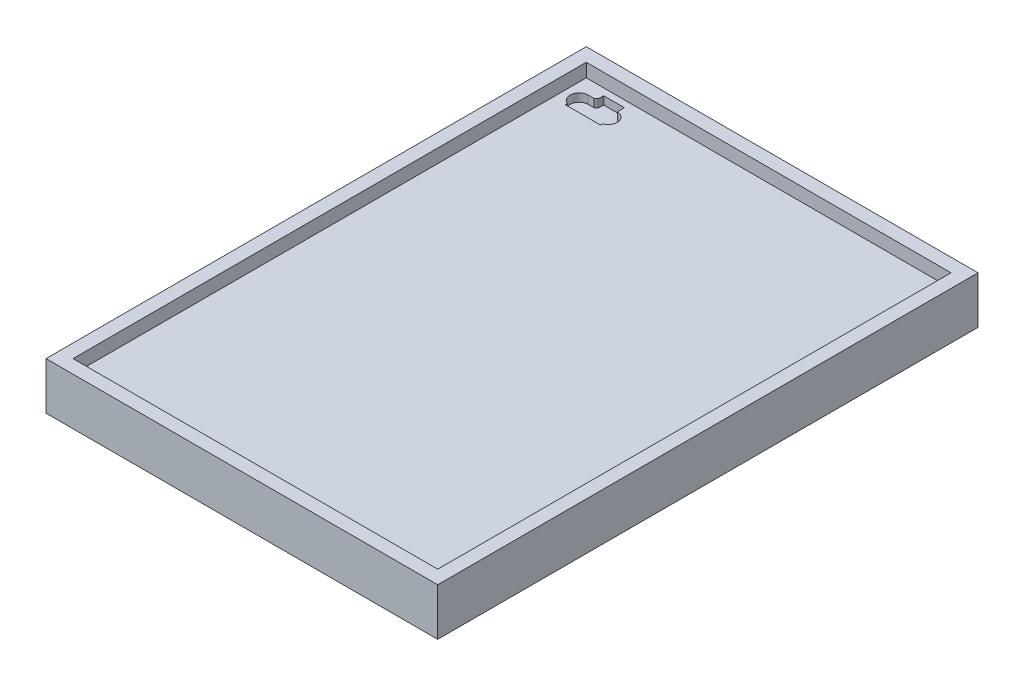
ISO-10303-21;
HEADER;
FILE_DESCRIPTION(('STEP AP214'),'2;1');
FILE_NAME('part.step','',(''),(''),'','','');
FILE_SCHEMA(('AUTOMOTIVE_DESIGN { 1 0 10303 214 1 1 1 1 }'));
ENDSEC;
DATA;
#1=APPLICATION_CONTEXT('core data for automotive mechanical design processes');
#2=APPLICATION_PROTOCOL_DEFINITION('international standard','automotive_design',2000,#1);
#3=PRODUCT_CONTEXT('',#1,'mechanical');
#4=PRODUCT('Part','Part','',(#3));
#5=PRODUCT_RELATED_PRODUCT_CATEGORY('part','',(#4));
#6=PRODUCT_DEFINITION_FORMATION('','',#4);
#7=PRODUCT_DEFINITION_CONTEXT('part definition',#1,'design');
#8=PRODUCT_DEFINITION('design','',#6,#7);
#9=PRODUCT_DEFINITION_SHAPE('','',#8);
#10=(LENGTH_UNIT() NAMED_UNIT(*) SI_UNIT(.MILLI.,.METRE.));
#11=(NAMED_UNIT(*) PLANE_ANGLE_UNIT() SI_UNIT($,.RADIAN.));
#12=(NAMED_UNIT(*) SI_UNIT($,.STERADIAN.) SOLID_ANGLE_UNIT());
#13=UNCERTAINTY_MEASURE_WITH_UNIT(LENGTH_MEASURE(1.E-05),#10,'distance_accuracy_value','');
#14=(GEOMETRIC_REPRESENTATION_CONTEXT(3) GLOBAL_UNCERTAINTY_ASSIGNED_CONTEXT((#13)) GLOBAL_UNIT_ASSIGNED_CONTEXT((#10,
#11,#12)) REPRESENTATION_CONTEXT('',''));
#15=CARTESIAN_POINT('',(0.,0.,0.));
#16=DIRECTION('',(0.,0.,1.));
#17=DIRECTION('',(1.,0.,0.));
#18=AXIS2_PLACEMENT_3D('',#15,#16,#17);
#19=CARTESIAN_POINT('',(0.,25.,0.));
#20=DIRECTION('',(0.,1.,0.));
#21=DIRECTION('',(0.,0.,1.));
#22=AXIS2_PLACEMENT_3D('',#19,#20,#21);
#23=PLANE('',#22);
#24=DIRECTION('',(1.,0.,0.));
#25=VECTOR('',#24,1.);
#26=CARTESIAN_POINT('',(-135.,25.,190.));
#27=LINE('',#26,#25);
#28=CARTESIAN_POINT('',(-135.,25.,190.));
#29=VERTEX_POINT('',#28);
#30=CARTESIAN_POINT('',(135.,25.,190.));
#31=VERTEX_POINT('',#30);
#32=EDGE_CURVE('E241',#29,#31,#27,.T.);
#33=ORIENTED_EDGE('',*,*,#32,.T.);
#34=DIRECTION('',(0.,0.,-1.));
#35=VECTOR('',#34,1.);
#36=CARTESIAN_POINT('',(135.,25.,190.));
#37=LINE('',#36,#35);
#38=CARTESIAN_POINT('',(135.,25.,-190.));
#39=VERTEX_POINT('',#38);
#40=EDGE_CURVE('E244',#31,#39,#37,.T.);
#41=ORIENTED_EDGE('',*,*,#40,.T.);
#42=DIRECTION('',(-1.,0.,0.));
#43=VECTOR('',#42,1.);
#44=CARTESIAN_POINT('',(135.,25.,-190.));
#45=LINE('',#44,#43);
#46=CARTESIAN_POINT('',(-135.,25.,-190.));
#47=VERTEX_POINT('',#46);
#48=EDGE_CURVE('E248',#39,#47,#45,.T.);
#49=ORIENTED_EDGE('',*,*,#48,.T.);
#50=DIRECTION('',(0.,0.,1.));
#51=VECTOR('',#50,1.);
#52=CARTESIAN_POINT('',(-135.,25.,-190.));
#53=LINE('',#52,#51);
#54=EDGE_CURVE('E251',#47,#29,#53,.T.);
#55=ORIENTED_EDGE('',*,*,#54,.T.);
#56=EDGE_LOOP('',(#33,#41,#49,#55));
#57=FACE_BOUND('',#56,.T.);
#58=DIRECTION('',(0.,0.,-1.));
#59=VECTOR('',#58,1.);
#60=CARTESIAN_POINT('',(-101.75,25.,2.66427341404739E-13));
#61=LINE('',#60,#59);
#62=CARTESIAN_POINT('',(-101.75,25.,-180.182738070745));
#63=VERTEX_POINT('',#62);
#64=CARTESIAN_POINT('',(-101.75,25.,-184.5));
#65=VERTEX_POINT('',#64);
#66=EDGE_CURVE('E398',#63,#65,#61,.T.);
#67=ORIENTED_EDGE('',*,*,#66,.F.);
#68=CARTESIAN_POINT('',(-101.25,25.,-180.182738070745));
#69=DIRECTION('',(0.,1.,0.));
#70=DIRECTION('',(0.,0.,1.));
#71=AXIS2_PLACEMENT_3D('',#68,#69,#70);
#72=CIRCLE('',#71,0.5);
#73=CARTESIAN_POINT('',(-101.284482758621,25.,-179.683928548624));
#74=VERTEX_POINT('',#73);
#75=EDGE_CURVE('E333',#63,#74,#72,.T.);
#76=ORIENTED_EDGE('',*,*,#75,.T.);
#77=CARTESIAN_POINT('',(-101.75,25.,-172.95));
#78=DIRECTION('',(0.,1.,0.));
#79=DIRECTION('',(0.,0.,1.));
#80=AXIS2_PLACEMENT_3D('',#77,#78,#79);
#81=CIRCLE('',#80,6.74999999999998);
#82=CARTESIAN_POINT('',(-99.1022841051659,25.,-166.740966215244));
#83=VERTEX_POINT('',#82);
#84=EDGE_CURVE('E396',#74,#83,#81,.F.);
#85=ORIENTED_EDGE('',*,*,#84,.T.);
#86=CARTESIAN_POINT('',(-98.9061570018448,25.,-166.281037786743));
#87=DIRECTION('',(0.,1.,0.));
#88=DIRECTION('',(0.,0.,1.));
#89=AXIS2_PLACEMENT_3D('',#86,#87,#88);
#90=CIRCLE('',#89,0.5);
#91=CARTESIAN_POINT('',(-99.4061570018448,25.,-166.281037786743));
#92=VERTEX_POINT('',#91);
#93=EDGE_CURVE('E323',#83,#92,#90,.T.);
#94=ORIENTED_EDGE('',*,*,#93,.T.);
#95=DIRECTION('',(0.,0.,1.));
#96=VECTOR('',#95,1.);
#97=CARTESIAN_POINT('',(-99.4061570018448,25.,0.));
#98=LINE('',#97,#96);
#99=CARTESIAN_POINT('',(-99.4061570018448,25.,-165.5));
#100=VERTEX_POINT('',#99);
#101=EDGE_CURVE('E410',#92,#100,#98,.T.);
#102=ORIENTED_EDGE('',*,*,#101,.T.);
#103=CARTESIAN_POINT('',(-99.9061570018448,25.,-165.5));
#104=DIRECTION('',(0.,1.,0.));
#105=DIRECTION('',(0.,0.,1.));
#106=AXIS2_PLACEMENT_3D('',#103,#104,#105);
#107=CIRCLE('',#106,0.5);
#108=CARTESIAN_POINT('',(-99.9061570018448,25.,-165.));
#109=VERTEX_POINT('',#108);
#110=EDGE_CURVE('E11',#100,#109,#107,.F.);
#111=ORIENTED_EDGE('',*,*,#110,.T.);
#112=DIRECTION('',(1.,0.,0.));
#113=VECTOR('',#112,1.);
#114=CARTESIAN_POINT('',(0.,25.,-165.));
#115=LINE('',#114,#113);
#116=CARTESIAN_POINT('',(-125.093842998155,25.,-165.));
#117=VERTEX_POINT('',#116);
#118=EDGE_CURVE('E376',#117,#109,#115,.T.);
#119=ORIENTED_EDGE('',*,*,#118,.F.);
#120=CARTESIAN_POINT('',(-125.093842998155,25.,-165.5));
#121=DIRECTION('',(0.,1.,0.));
#122=DIRECTION('',(0.,0.,1.));
#123=AXIS2_PLACEMENT_3D('',#120,#121,#122);
#124=CIRCLE('',#123,0.5);
#125=CARTESIAN_POINT('',(-125.593842998155,25.,-165.5));
#126=VERTEX_POINT('',#125);
#127=EDGE_CURVE('E41',#117,#126,#124,.F.);
#128=ORIENTED_EDGE('',*,*,#127,.T.);
#129=DIRECTION('',(0.,0.,1.));
#130=VECTOR('',#129,1.);
#131=CARTESIAN_POINT('',(-125.593842998155,25.,0.));
#132=LINE('',#131,#130);
#133=CARTESIAN_POINT('',(-125.593842998155,25.,-166.281037786743));
#134=VERTEX_POINT('',#133);
#135=EDGE_CURVE('E374',#134,#126,#132,.T.);
#136=ORIENTED_EDGE('',*,*,#135,.F.);
#137=CARTESIAN_POINT('',(-126.093842998155,25.,-166.281037786743));
#138=DIRECTION('',(0.,1.,0.));
#139=DIRECTION('',(0.,0.,1.));
#140=AXIS2_PLACEMENT_3D('',#137,#138,#139);
#141=CIRCLE('',#140,0.5);
#142=CARTESIAN_POINT('',(-125.897715894834,25.,-166.740966215244));
#143=VERTEX_POINT('',#142);
#144=EDGE_CURVE('E314',#134,#143,#141,.T.);
#145=ORIENTED_EDGE('',*,*,#144,.T.);
#146=CARTESIAN_POINT('',(-123.25,25.,-172.95));
#147=DIRECTION('',(0.,1.,0.));
#148=DIRECTION('',(0.,0.,1.));
#149=AXIS2_PLACEMENT_3D('',#146,#147,#148);
#150=CIRCLE('',#149,6.74999999999999);
#151=CARTESIAN_POINT('',(-123.25,25.,-179.7));
#152=VERTEX_POINT('',#151);
#153=EDGE_CURVE('E384',#152,#143,#150,.T.);
#154=ORIENTED_EDGE('',*,*,#153,.F.);
#155=DIRECTION('',(1.,0.,0.));
#156=VECTOR('',#155,1.);
#157=CARTESIAN_POINT('',(-2.28233147419287E-12,25.,-179.700000000001));
#158=LINE('',#157,#156);
#159=CARTESIAN_POINT('',(-118.879314151318,25.,-179.7));
#160=VERTEX_POINT('',#159);
#161=EDGE_CURVE('E406',#152,#160,#158,.T.);
#162=ORIENTED_EDGE('',*,*,#161,.T.);
#163=DIRECTION('',(-0.696937908891496,0.,0.717131474103562));
#164=VECTOR('',#163,1.);
#165=CARTESIAN_POINT('',(-150.950323524299,25.,-146.699742826135));
#166=LINE('',#165,#164);
#167=CARTESIAN_POINT('',(-117.695737051793,25.,-180.917870888165));
#168=VERTEX_POINT('',#167);
#169=EDGE_CURVE('E232',#168,#160,#166,.T.);
#170=ORIENTED_EDGE('',*,*,#169,.F.);
#171=CARTESIAN_POINT('',(-119.13,25.,-182.311746705948));
#172=DIRECTION('',(0.,1.,0.));
#173=DIRECTION('',(0.,0.,1.));
#174=AXIS2_PLACEMENT_3D('',#171,#172,#173);
#175=CIRCLE('',#174,2.);
#176=CARTESIAN_POINT('',(-117.13,25.,-182.311746705948));
#177=VERTEX_POINT('',#176);
#178=EDGE_CURVE('E304',#168,#177,#175,.T.);
#179=ORIENTED_EDGE('',*,*,#178,.T.);
#180=DIRECTION('',(0.,0.,1.));
#181=VECTOR('',#180,1.);
#182=CARTESIAN_POINT('',(-117.13,25.,0.));
#183=LINE('',#182,#181);
#184=CARTESIAN_POINT('',(-117.13,25.,-184.5));
#185=VERTEX_POINT('',#184);
#186=EDGE_CURVE('E403',#185,#177,#183,.T.);
#187=ORIENTED_EDGE('',*,*,#186,.F.);
#188=CARTESIAN_POINT('',(-116.63,25.,-184.5));
#189=DIRECTION('',(0.,1.,0.));
#190=DIRECTION('',(0.,0.,1.));
#191=AXIS2_PLACEMENT_3D('',#188,#189,#190);
#192=CIRCLE('',#191,0.5);
#193=CARTESIAN_POINT('',(-116.63,25.,-185.));
#194=VERTEX_POINT('',#193);
#195=EDGE_CURVE('E356',#185,#194,#192,.F.);
#196=ORIENTED_EDGE('',*,*,#195,.T.);
#197=DIRECTION('',(1.,0.,0.));
#198=VECTOR('',#197,1.);
#199=CARTESIAN_POINT('',(0.,25.,-185.));
#200=LINE('',#199,#198);
#201=CARTESIAN_POINT('',(-102.25,25.,-185.));
#202=VERTEX_POINT('',#201);
#203=EDGE_CURVE('E401',#194,#202,#200,.T.);
#204=ORIENTED_EDGE('',*,*,#203,.T.);
#205=CARTESIAN_POINT('',(-102.25,25.,-184.5));
#206=DIRECTION('',(0.,1.,0.));
#207=DIRECTION('',(0.,0.,1.));
#208=AXIS2_PLACEMENT_3D('',#205,#206,#207);
#209=CIRCLE('',#208,0.5);
#210=EDGE_CURVE('E347',#202,#65,#209,.F.);
#211=ORIENTED_EDGE('',*,*,#210,.T.);
#212=EDGE_LOOP('',(#67,#76,#85,#94,#102,#111,#119,#128,#136,#145,#154,#162,#170,#179,#187,#196,
#204,#211));
#213=FACE_BOUND('',#212,.T.);
#214=ADVANCED_FACE('F33',(#57,#213),#23,.T.);
#215=CARTESIAN_POINT('',(145.,35.,-200.));
#216=DIRECTION('',(-1.,0.,0.));
#217=DIRECTION('',(0.,0.,1.));
#218=AXIS2_PLACEMENT_3D('',#215,#216,#217);
#219=PLANE('',#218);
#220=DIRECTION('',(0.,0.,-1.));
#221=VECTOR('',#220,1.);
#222=CARTESIAN_POINT('',(145.,0.,-200.));
#223=LINE('',#222,#221);
#224=CARTESIAN_POINT('',(145.,0.,200.));
#225=VERTEX_POINT('',#224);
#226=CARTESIAN_POINT('',(145.,0.,-200.));
#227=VERTEX_POINT('',#226);
#228=EDGE_CURVE('E266',#225,#227,#223,.T.);
#229=ORIENTED_EDGE('',*,*,#228,.T.);
#230=DIRECTION('',(0.,-1.,0.));
#231=VECTOR('',#230,1.);
#232=CARTESIAN_POINT('',(145.,35.,-200.));
#233=LINE('',#232,#231);
#234=CARTESIAN_POINT('',(145.,35.,-200.));
#235=VERTEX_POINT('',#234);
#236=EDGE_CURVE('E299',#235,#227,#233,.T.);
#237=ORIENTED_EDGE('',*,*,#236,.F.);
#238=DIRECTION('',(0.,0.,-1.));
#239=VECTOR('',#238,1.);
#240=CARTESIAN_POINT('',(145.,35.,-200.));
#241=LINE('',#240,#239);
#242=CARTESIAN_POINT('',(145.,35.,200.));
#243=VERTEX_POINT('',#242);
#244=EDGE_CURVE('E273',#243,#235,#241,.T.);
#245=ORIENTED_EDGE('',*,*,#244,.F.);
#246=DIRECTION('',(0.,-1.,0.));
#247=VECTOR('',#246,1.);
#248=CARTESIAN_POINT('',(145.,35.,200.));
#249=LINE('',#248,#247);
#250=EDGE_CURVE('E283',#243,#225,#249,.T.);
#251=ORIENTED_EDGE('',*,*,#250,.T.);
#252=EDGE_LOOP('',(#229,#237,#245,#251));
#253=FACE_BOUND('',#252,.T.);
#254=ADVANCED_FACE('F475',(#253),#219,.F.);
#255=CARTESIAN_POINT('',(-145.,35.,-200.));
#256=DIRECTION('',(0.,0.,1.));
#257=DIRECTION('',(1.,0.,0.));
#258=AXIS2_PLACEMENT_3D('',#255,#256,#257);
#259=PLANE('',#258);
#260=DIRECTION('',(-1.,0.,0.));
#261=VECTOR('',#260,1.);
#262=CARTESIAN_POINT('',(-145.,0.,-200.));
#263=LINE('',#262,#261);
#264=CARTESIAN_POINT('',(-145.,0.,-200.));
#265=VERTEX_POINT('',#264);
#266=EDGE_CURVE('E286',#227,#265,#263,.T.);
#267=ORIENTED_EDGE('',*,*,#266,.T.);
#268=DIRECTION('',(0.,-1.,0.));
#269=VECTOR('',#268,1.);
#270=CARTESIAN_POINT('',(-145.,35.,-200.));
#271=LINE('',#270,#269);
#272=CARTESIAN_POINT('',(-145.,35.,-200.));
#273=VERTEX_POINT('',#272);
#274=EDGE_CURVE('E296',#273,#265,#271,.T.);
#275=ORIENTED_EDGE('',*,*,#274,.F.);
#276=DIRECTION('',(-1.,0.,0.));
#277=VECTOR('',#276,1.);
#278=CARTESIAN_POINT('',(-145.,35.,-200.));
#279=LINE('',#278,#277);
#280=EDGE_CURVE('E276',#235,#273,#279,.T.);
#281=ORIENTED_EDGE('',*,*,#280,.F.);
#282=ORIENTED_EDGE('',*,*,#236,.T.);
#283=EDGE_LOOP('',(#267,#275,#281,#282));
#284=FACE_BOUND('',#283,.T.);
#285=ADVANCED_FACE('F483',(#284),#259,.F.);
#286=CARTESIAN_POINT('',(-145.,35.,-200.));
#287=DIRECTION('',(1.,0.,0.));
#288=DIRECTION('',(0.,0.,-1.));
#289=AXIS2_PLACEMENT_3D('',#286,#287,#288);
#290=PLANE('',#289);
#291=DIRECTION('',(0.,0.,1.));
#292=VECTOR('',#291,1.);
#293=CARTESIAN_POINT('',(-145.,0.,-200.));
#294=LINE('',#293,#292);
#295=CARTESIAN_POINT('',(-145.,0.,200.));
#296=VERTEX_POINT('',#295);
#297=EDGE_CURVE('E288',#265,#296,#294,.T.);
#298=ORIENTED_EDGE('',*,*,#297,.T.);
#299=DIRECTION('',(0.,-1.,0.));
#300=VECTOR('',#299,1.);
#301=CARTESIAN_POINT('',(-145.,35.,200.));
#302=LINE('',#301,#300);
#303=CARTESIAN_POINT('',(-145.,35.,200.));
#304=VERTEX_POINT('',#303);
#305=EDGE_CURVE('E293',#304,#296,#302,.T.);
#306=ORIENTED_EDGE('',*,*,#305,.F.);
#307=DIRECTION('',(0.,0.,1.));
#308=VECTOR('',#307,1.);
#309=CARTESIAN_POINT('',(-145.,35.,-200.));
#310=LINE('',#309,#308);
#311=EDGE_CURVE('E279',#273,#304,#310,.T.);
#312=ORIENTED_EDGE('',*,*,#311,.F.);
#313=ORIENTED_EDGE('',*,*,#274,.T.);
#314=EDGE_LOOP('',(#298,#306,#312,#313));
#315=FACE_BOUND('',#314,.T.);
#316=ADVANCED_FACE('F516',(#315),#290,.F.);
#317=CARTESIAN_POINT('',(-145.,35.,200.));
#318=DIRECTION('',(0.,0.,-1.));
#319=DIRECTION('',(-1.,0.,0.));
#320=AXIS2_PLACEMENT_3D('',#317,#318,#319);
#321=PLANE('',#320);
#322=DIRECTION('',(1.,0.,0.));
#323=VECTOR('',#322,1.);
#324=CARTESIAN_POINT('',(-145.,0.,200.));
#325=LINE('',#324,#323);
#326=EDGE_CURVE('E277',#296,#225,#325,.T.);
#327=ORIENTED_EDGE('',*,*,#326,.T.);
#328=ORIENTED_EDGE('',*,*,#250,.F.);
#329=DIRECTION('',(1.,0.,0.));
#330=VECTOR('',#329,1.);
#331=CARTESIAN_POINT('',(-145.,35.,200.));
#332=LINE('',#331,#330);
#333=EDGE_CURVE('E281',#304,#243,#332,.T.);
#334=ORIENTED_EDGE('',*,*,#333,.F.);
#335=ORIENTED_EDGE('',*,*,#305,.T.);
#336=EDGE_LOOP('',(#327,#328,#334,#335));
#337=FACE_BOUND('',#336,.T.);
#338=ADVANCED_FACE('F509',(#337),#321,.F.);
#339=CARTESIAN_POINT('',(0.,35.,0.));
#340=DIRECTION('',(0.,1.,0.));
#341=DIRECTION('',(0.,0.,1.));
#342=AXIS2_PLACEMENT_3D('',#339,#340,#341);
#343=PLANE('',#342);
#344=DIRECTION('',(1.,0.,0.));
#345=VECTOR('',#344,1.);
#346=CARTESIAN_POINT('',(-135.,35.,190.));
#347=LINE('',#346,#345);
#348=CARTESIAN_POINT('',(-135.,35.,190.));
#349=VERTEX_POINT('',#348);
#350=CARTESIAN_POINT('',(135.,35.,190.));
#351=VERTEX_POINT('',#350);
#352=EDGE_CURVE('E235',#349,#351,#347,.T.);
#353=ORIENTED_EDGE('',*,*,#352,.F.);
#354=DIRECTION('',(0.,0.,1.));
#355=VECTOR('',#354,1.);
#356=CARTESIAN_POINT('',(-135.,35.,-190.));
#357=LINE('',#356,#355);
#358=CARTESIAN_POINT('',(-135.,35.,-190.));
#359=VERTEX_POINT('',#358);
#360=EDGE_CURVE('E245',#359,#349,#357,.T.);
#361=ORIENTED_EDGE('',*,*,#360,.F.);
#362=DIRECTION('',(-1.,0.,0.));
#363=VECTOR('',#362,1.);
#364=CARTESIAN_POINT('',(135.,35.,-190.));
#365=LINE('',#364,#363);
#366=CARTESIAN_POINT('',(135.,35.,-190.));
#367=VERTEX_POINT('',#366);
#368=EDGE_CURVE('E259',#367,#359,#365,.T.);
#369=ORIENTED_EDGE('',*,*,#368,.F.);
#370=DIRECTION('',(0.,0.,-1.));
#371=VECTOR('',#370,1.);
#372=CARTESIAN_POINT('',(135.,35.,190.));
#373=LINE('',#372,#371);
#374=EDGE_CURVE('E256',#351,#367,#373,.T.);
#375=ORIENTED_EDGE('',*,*,#374,.F.);
#376=EDGE_LOOP('',(#353,#361,#369,#375));
#377=FACE_BOUND('',#376,.T.);
#378=ORIENTED_EDGE('',*,*,#244,.T.);
#379=ORIENTED_EDGE('',*,*,#280,.T.);
#380=ORIENTED_EDGE('',*,*,#311,.T.);
#381=ORIENTED_EDGE('',*,*,#333,.T.);
#382=EDGE_LOOP('',(#378,#379,#380,#381));
#383=FACE_BOUND('',#382,.T.);
#384=ADVANCED_FACE('F506',(#377,#383),#343,.T.);
#385=CARTESIAN_POINT('',(0.,0.,0.));
#386=DIRECTION('',(0.,1.,0.));
#387=DIRECTION('',(0.,0.,1.));
#388=AXIS2_PLACEMENT_3D('',#385,#386,#387);
#389=PLANE('',#388);
#390=ORIENTED_EDGE('',*,*,#228,.F.);
#391=ORIENTED_EDGE('',*,*,#326,.F.);
#392=ORIENTED_EDGE('',*,*,#297,.F.);
#393=ORIENTED_EDGE('',*,*,#266,.F.);
#394=EDGE_LOOP('',(#390,#391,#392,#393));
#395=FACE_BOUND('',#394,.T.);
#396=ADVANCED_FACE('F504',(#395),#389,.F.);
#397=CARTESIAN_POINT('',(-135.,25.,190.));
#398=DIRECTION('',(0.,0.,1.));
#399=DIRECTION('',(1.,0.,0.));
#400=AXIS2_PLACEMENT_3D('',#397,#398,#399);
#401=PLANE('',#400);
#402=ORIENTED_EDGE('',*,*,#352,.T.);
#403=DIRECTION('',(0.,1.,0.));
#404=VECTOR('',#403,1.);
#405=CARTESIAN_POINT('',(135.,25.,190.));
#406=LINE('',#405,#404);
#407=EDGE_CURVE('E254',#31,#351,#406,.T.);
#408=ORIENTED_EDGE('',*,*,#407,.F.);
#409=ORIENTED_EDGE('',*,*,#32,.F.);
#410=DIRECTION('',(0.,1.,0.));
#411=VECTOR('',#410,1.);
#412=CARTESIAN_POINT('',(-135.,25.,190.));
#413=LINE('',#412,#411);
#414=EDGE_CURVE('E264',#29,#349,#413,.T.);
#415=ORIENTED_EDGE('',*,*,#414,.T.);
#416=EDGE_LOOP('',(#402,#408,#409,#415));
#417=FACE_BOUND('',#416,.T.);
#418=ADVANCED_FACE('F493',(#417),#401,.F.);
#419=CARTESIAN_POINT('',(-135.,25.,-190.));
#420=DIRECTION('',(-1.,0.,0.));
#421=DIRECTION('',(0.,0.,1.));
#422=AXIS2_PLACEMENT_3D('',#419,#420,#421);
#423=PLANE('',#422);
#424=ORIENTED_EDGE('',*,*,#360,.T.);
#425=ORIENTED_EDGE('',*,*,#414,.F.);
#426=ORIENTED_EDGE('',*,*,#54,.F.);
#427=DIRECTION('',(0.,1.,0.));
#428=VECTOR('',#427,1.);
#429=CARTESIAN_POINT('',(-135.,25.,-190.));
#430=LINE('',#429,#428);
#431=EDGE_CURVE('E267',#47,#359,#430,.T.);
#432=ORIENTED_EDGE('',*,*,#431,.T.);
#433=EDGE_LOOP('',(#424,#425,#426,#432));
#434=FACE_BOUND('',#433,.T.);
#435=ADVANCED_FACE('F489',(#434),#423,.F.);
#436=CARTESIAN_POINT('',(135.,25.,-190.));
#437=DIRECTION('',(0.,0.,-1.));
#438=DIRECTION('',(-1.,0.,0.));
#439=AXIS2_PLACEMENT_3D('',#436,#437,#438);
#440=PLANE('',#439);
#441=ORIENTED_EDGE('',*,*,#368,.T.);
#442=ORIENTED_EDGE('',*,*,#431,.F.);
#443=ORIENTED_EDGE('',*,*,#48,.F.);
#444=DIRECTION('',(0.,1.,0.));
#445=VECTOR('',#444,1.);
#446=CARTESIAN_POINT('',(135.,25.,-190.));
#447=LINE('',#446,#445);
#448=EDGE_CURVE('E269',#39,#367,#447,.T.);
#449=ORIENTED_EDGE('',*,*,#448,.T.);
#450=EDGE_LOOP('',(#441,#442,#443,#449));
#451=FACE_BOUND('',#450,.T.);
#452=ADVANCED_FACE('F492',(#451),#440,.F.);
#453=CARTESIAN_POINT('',(135.,25.,190.));
#454=DIRECTION('',(1.,0.,0.));
#455=DIRECTION('',(0.,0.,-1.));
#456=AXIS2_PLACEMENT_3D('',#453,#454,#455);
#457=PLANE('',#456);
#458=ORIENTED_EDGE('',*,*,#374,.T.);
#459=ORIENTED_EDGE('',*,*,#448,.F.);
#460=ORIENTED_EDGE('',*,*,#40,.F.);
#461=ORIENTED_EDGE('',*,*,#407,.T.);
#462=EDGE_LOOP('',(#458,#459,#460,#461));
#463=FACE_BOUND('',#462,.T.);
#464=ADVANCED_FACE('F497',(#463),#457,.F.);
#465=CARTESIAN_POINT('',(-101.75,19.,-172.95));
#466=DIRECTION('',(0.,1.,0.));
#467=DIRECTION('',(0.,0.,1.));
#468=AXIS2_PLACEMENT_3D('',#465,#466,#467);
#469=CYLINDRICAL_SURFACE('',#468,6.74999999999998);
#470=ORIENTED_EDGE('',*,*,#84,.F.);
#471=DIRECTION('',(0.,1.,0.));
#472=VECTOR('',#471,1.);
#473=CARTESIAN_POINT('',(-101.284482758621,19.,-179.683928548624));
#474=LINE('',#473,#472);
#475=CARTESIAN_POINT('',(-101.284482758621,19.,-179.683928548624));
#476=VERTEX_POINT('',#475);
#477=EDGE_CURVE('E335',#74,#476,#474,.F.);
#478=ORIENTED_EDGE('',*,*,#477,.T.);
#479=CARTESIAN_POINT('',(-101.75,19.,-172.95));
#480=DIRECTION('',(0.,1.,0.));
#481=DIRECTION('',(0.,0.,1.));
#482=AXIS2_PLACEMENT_3D('',#479,#480,#481);
#483=CIRCLE('',#482,6.74999999999998);
#484=CARTESIAN_POINT('',(-99.1022841051659,19.,-166.740966215244));
#485=VERTEX_POINT('',#484);
#486=EDGE_CURVE('E412',#476,#485,#483,.F.);
#487=ORIENTED_EDGE('',*,*,#486,.T.);
#488=DIRECTION('',(0.,1.,0.));
#489=VECTOR('',#488,1.);
#490=CARTESIAN_POINT('',(-99.1022841051659,19.,-166.740966215244));
#491=LINE('',#490,#489);
#492=EDGE_CURVE('E320',#485,#83,#491,.T.);
#493=ORIENTED_EDGE('',*,*,#492,.T.);
#494=EDGE_LOOP('',(#470,#478,#487,#493));
#495=FACE_BOUND('',#494,.T.);
#496=ADVANCED_FACE('F462',(#495),#469,.F.);
#497=CARTESIAN_POINT('',(-99.4061570018448,19.,0.));
#498=DIRECTION('',(-1.,0.,0.));
#499=DIRECTION('',(0.,0.,1.));
#500=AXIS2_PLACEMENT_3D('',#497,#498,#499);
#501=PLANE('',#500);
#502=DIRECTION('',(0.,0.,1.));
#503=VECTOR('',#502,1.);
#504=CARTESIAN_POINT('',(-99.4061570018448,19.,0.));
#505=LINE('',#504,#503);
#506=CARTESIAN_POINT('',(-99.4061570018448,19.,-166.281037786743));
#507=VERTEX_POINT('',#506);
#508=CARTESIAN_POINT('',(-99.4061570018448,19.,-165.5));
#509=VERTEX_POINT('',#508);
#510=EDGE_CURVE('E233',#507,#509,#505,.T.);
#511=ORIENTED_EDGE('',*,*,#510,.T.);
#512=DIRECTION('',(0.,1.,0.));
#513=VECTOR('',#512,1.);
#514=CARTESIAN_POINT('',(-99.4061570018448,19.,-165.5));
#515=LINE('',#514,#513);
#516=EDGE_CURVE('E368',#509,#100,#515,.T.);
#517=ORIENTED_EDGE('',*,*,#516,.T.);
#518=ORIENTED_EDGE('',*,*,#101,.F.);
#519=DIRECTION('',(0.,1.,0.));
#520=VECTOR('',#519,1.);
#521=CARTESIAN_POINT('',(-99.4061570018448,19.,-166.281037786743));
#522=LINE('',#521,#520);
#523=EDGE_CURVE('E325',#92,#507,#522,.F.);
#524=ORIENTED_EDGE('',*,*,#523,.T.);
#525=EDGE_LOOP('',(#511,#517,#518,#524));
#526=FACE_BOUND('',#525,.T.);
#527=ADVANCED_FACE('F469',(#526),#501,.T.);
#528=CARTESIAN_POINT('',(0.,19.,-165.));
#529=DIRECTION('',(0.,0.,1.));
#530=DIRECTION('',(1.,0.,0.));
#531=AXIS2_PLACEMENT_3D('',#528,#529,#530);
#532=PLANE('',#531);
#533=DIRECTION('',(1.,0.,0.));
#534=VECTOR('',#533,1.);
#535=CARTESIAN_POINT('',(0.,19.,-165.));
#536=LINE('',#535,#534);
#537=CARTESIAN_POINT('',(-125.093842998155,19.,-165.));
#538=VERTEX_POINT('',#537);
#539=CARTESIAN_POINT('',(-99.9061570018448,19.,-165.));
#540=VERTEX_POINT('',#539);
#541=EDGE_CURVE('E237',#538,#540,#536,.T.);
#542=ORIENTED_EDGE('',*,*,#541,.F.);
#543=DIRECTION('',(0.,1.,0.));
#544=VECTOR('',#543,1.);
#545=CARTESIAN_POINT('',(-125.093842998155,25.,-165.));
#546=LINE('',#545,#544);
#547=EDGE_CURVE('E360',#538,#117,#546,.T.);
#548=ORIENTED_EDGE('',*,*,#547,.T.);
#549=ORIENTED_EDGE('',*,*,#118,.T.);
#550=DIRECTION('',(0.,1.,0.));
#551=VECTOR('',#550,1.);
#552=CARTESIAN_POINT('',(-99.9061570018448,19.,-165.));
#553=LINE('',#552,#551);
#554=EDGE_CURVE('E358',#109,#540,#553,.F.);
#555=ORIENTED_EDGE('',*,*,#554,.T.);
#556=EDGE_LOOP('',(#542,#548,#549,#555));
#557=FACE_BOUND('',#556,.T.);
#558=ADVANCED_FACE('F391',(#557),#532,.F.);
#559=CARTESIAN_POINT('',(-125.593842998155,19.,0.));
#560=DIRECTION('',(-1.,0.,0.));
#561=DIRECTION('',(0.,0.,1.));
#562=AXIS2_PLACEMENT_3D('',#559,#560,#561);
#563=PLANE('',#562);
#564=ORIENTED_EDGE('',*,*,#135,.T.);
#565=DIRECTION('',(0.,1.,0.));
#566=VECTOR('',#565,1.);
#567=CARTESIAN_POINT('',(-125.593842998155,19.,-165.5));
#568=LINE('',#567,#566);
#569=CARTESIAN_POINT('',(-125.593842998155,19.,-165.5));
#570=VERTEX_POINT('',#569);
#571=EDGE_CURVE('E363',#126,#570,#568,.F.);
#572=ORIENTED_EDGE('',*,*,#571,.T.);
#573=DIRECTION('',(0.,0.,1.));
#574=VECTOR('',#573,1.);
#575=CARTESIAN_POINT('',(-125.593842998155,19.,0.));
#576=LINE('',#575,#574);
#577=CARTESIAN_POINT('',(-125.593842998155,19.,-166.281037786743));
#578=VERTEX_POINT('',#577);
#579=EDGE_CURVE('E389',#578,#570,#576,.T.);
#580=ORIENTED_EDGE('',*,*,#579,.F.);
#581=DIRECTION('',(0.,1.,0.));
#582=VECTOR('',#581,1.);
#583=CARTESIAN_POINT('',(-125.593842998155,19.,-166.281037786743));
#584=LINE('',#583,#582);
#585=EDGE_CURVE('E311',#578,#134,#584,.T.);
#586=ORIENTED_EDGE('',*,*,#585,.T.);
#587=EDGE_LOOP('',(#564,#572,#580,#586));
#588=FACE_BOUND('',#587,.T.);
#589=ADVANCED_FACE('F381',(#588),#563,.F.);
#590=CARTESIAN_POINT('',(-123.25,19.,-172.95));
#591=DIRECTION('',(0.,1.,0.));
#592=DIRECTION('',(0.,0.,1.));
#593=AXIS2_PLACEMENT_3D('',#590,#591,#592);
#594=CYLINDRICAL_SURFACE('',#593,6.74999999999999);
#595=ORIENTED_EDGE('',*,*,#153,.T.);
#596=DIRECTION('',(0.,1.,0.));
#597=VECTOR('',#596,1.);
#598=CARTESIAN_POINT('',(-125.897715894834,19.,-166.740966215244));
#599=LINE('',#598,#597);
#600=CARTESIAN_POINT('',(-125.897715894834,19.,-166.740966215244));
#601=VERTEX_POINT('',#600);
#602=EDGE_CURVE('E316',#143,#601,#599,.F.);
#603=ORIENTED_EDGE('',*,*,#602,.T.);
#604=CARTESIAN_POINT('',(-123.25,19.,-172.95));
#605=DIRECTION('',(0.,1.,0.));
#606=DIRECTION('',(0.,0.,1.));
#607=AXIS2_PLACEMENT_3D('',#604,#605,#606);
#608=CIRCLE('',#607,6.74999999999999);
#609=CARTESIAN_POINT('',(-123.25,19.,-179.7));
#610=VERTEX_POINT('',#609);
#611=EDGE_CURVE('E228',#610,#601,#608,.T.);
#612=ORIENTED_EDGE('',*,*,#611,.F.);
#613=DIRECTION('',(0.,1.,0.));
#614=VECTOR('',#613,1.);
#615=CARTESIAN_POINT('',(-123.25,19.,-179.7));
#616=LINE('',#615,#614);
#617=EDGE_CURVE('E227',#610,#152,#616,.T.);
#618=ORIENTED_EDGE('',*,*,#617,.T.);
#619=EDGE_LOOP('',(#595,#603,#612,#618));
#620=FACE_BOUND('',#619,.T.);
#621=ADVANCED_FACE('F429',(#620),#594,.F.);
#622=CARTESIAN_POINT('',(-2.28233147419287E-12,19.,-179.700000000001));
#623=DIRECTION('',(0.,0.,1.));
#624=DIRECTION('',(1.,0.,0.));
#625=AXIS2_PLACEMENT_3D('',#622,#623,#624);
#626=PLANE('',#625);
#627=ORIENTED_EDGE('',*,*,#161,.F.);
#628=ORIENTED_EDGE('',*,*,#617,.F.);
#629=DIRECTION('',(1.,0.,0.));
#630=VECTOR('',#629,1.);
#631=CARTESIAN_POINT('',(-2.28233147419287E-12,19.,-179.700000000001));
#632=LINE('',#631,#630);
#633=CARTESIAN_POINT('',(-118.879314151318,19.,-179.7));
#634=VERTEX_POINT('',#633);
#635=EDGE_CURVE('E211',#610,#634,#632,.T.);
#636=ORIENTED_EDGE('',*,*,#635,.T.);
#637=DIRECTION('',(0.,1.,0.));
#638=VECTOR('',#637,1.);
#639=CARTESIAN_POINT('',(-118.879314151318,19.,-179.7));
#640=LINE('',#639,#638);
#641=EDGE_CURVE('E225',#634,#160,#640,.T.);
#642=ORIENTED_EDGE('',*,*,#641,.T.);
#643=EDGE_LOOP('',(#627,#628,#636,#642));
#644=FACE_BOUND('',#643,.T.);
#645=ADVANCED_FACE('F224',(#644),#626,.T.);
#646=CARTESIAN_POINT('',(-150.950323524299,19.,-146.699742826135));
#647=DIRECTION('',(-0.717131474103562,0.,-0.696937908891496));
#648=DIRECTION('',(-0.696937908891496,0.,0.717131474103562));
#649=AXIS2_PLACEMENT_3D('',#646,#647,#648);
#650=PLANE('',#649);
#651=DIRECTION('',(-0.696937908891496,0.,0.717131474103562));
#652=VECTOR('',#651,1.);
#653=CARTESIAN_POINT('',(-150.950323524299,19.,-146.699742826135));
#654=LINE('',#653,#652);
#655=CARTESIAN_POINT('',(-117.695737051793,19.,-180.917870888165));
#656=VERTEX_POINT('',#655);
#657=EDGE_CURVE('E206',#656,#634,#654,.T.);
#658=ORIENTED_EDGE('',*,*,#657,.F.);
#659=DIRECTION('',(0.,1.,0.));
#660=VECTOR('',#659,1.);
#661=CARTESIAN_POINT('',(-117.695737051793,19.,-180.917870888165));
#662=LINE('',#661,#660);
#663=EDGE_CURVE('E302',#656,#168,#662,.T.);
#664=ORIENTED_EDGE('',*,*,#663,.T.);
#665=ORIENTED_EDGE('',*,*,#169,.T.);
#666=ORIENTED_EDGE('',*,*,#641,.F.);
#667=EDGE_LOOP('',(#658,#664,#665,#666));
#668=FACE_BOUND('',#667,.T.);
#669=ADVANCED_FACE('F230',(#668),#650,.F.);
#670=CARTESIAN_POINT('',(-117.13,19.,0.));
#671=DIRECTION('',(-1.,0.,0.));
#672=DIRECTION('',(0.,0.,1.));
#673=AXIS2_PLACEMENT_3D('',#670,#671,#672);
#674=PLANE('',#673);
#675=DIRECTION('',(0.,0.,1.));
#676=VECTOR('',#675,1.);
#677=CARTESIAN_POINT('',(-117.13,19.,0.));
#678=LINE('',#677,#676);
#679=CARTESIAN_POINT('',(-117.13,19.,-184.5));
#680=VERTEX_POINT('',#679);
#681=CARTESIAN_POINT('',(-117.13,19.,-182.311746705948));
#682=VERTEX_POINT('',#681);
#683=EDGE_CURVE('E219',#680,#682,#678,.T.);
#684=ORIENTED_EDGE('',*,*,#683,.F.);
#685=DIRECTION('',(0.,1.,0.));
#686=VECTOR('',#685,1.);
#687=CARTESIAN_POINT('',(-117.13,19.,-184.5));
#688=LINE('',#687,#686);
#689=EDGE_CURVE('E349',#680,#185,#688,.T.);
#690=ORIENTED_EDGE('',*,*,#689,.T.);
#691=ORIENTED_EDGE('',*,*,#186,.T.);
#692=DIRECTION('',(0.,1.,0.));
#693=VECTOR('',#692,1.);
#694=CARTESIAN_POINT('',(-117.13,19.,-182.311746705948));
#695=LINE('',#694,#693);
#696=EDGE_CURVE('E307',#177,#682,#695,.F.);
#697=ORIENTED_EDGE('',*,*,#696,.T.);
#698=EDGE_LOOP('',(#684,#690,#691,#697));
#699=FACE_BOUND('',#698,.T.);
#700=ADVANCED_FACE('F436',(#699),#674,.F.);
#701=CARTESIAN_POINT('',(0.,19.,-185.));
#702=DIRECTION('',(0.,0.,1.));
#703=DIRECTION('',(1.,0.,0.));
#704=AXIS2_PLACEMENT_3D('',#701,#702,#703);
#705=PLANE('',#704);
#706=ORIENTED_EDGE('',*,*,#203,.F.);
#707=DIRECTION('',(0.,1.,0.));
#708=VECTOR('',#707,1.);
#709=CARTESIAN_POINT('',(-116.63,19.,-185.));
#710=LINE('',#709,#708);
#711=CARTESIAN_POINT('',(-116.63,19.,-185.));
#712=VERTEX_POINT('',#711);
#713=EDGE_CURVE('E352',#194,#712,#710,.F.);
#714=ORIENTED_EDGE('',*,*,#713,.T.);
#715=DIRECTION('',(1.,0.,0.));
#716=VECTOR('',#715,1.);
#717=CARTESIAN_POINT('',(0.,19.,-185.));
#718=LINE('',#717,#716);
#719=CARTESIAN_POINT('',(-102.25,19.,-185.));
#720=VERTEX_POINT('',#719);
#721=EDGE_CURVE('E419',#712,#720,#718,.T.);
#722=ORIENTED_EDGE('',*,*,#721,.T.);
#723=DIRECTION('',(0.,1.,0.));
#724=VECTOR('',#723,1.);
#725=CARTESIAN_POINT('',(-102.25,19.,-185.));
#726=LINE('',#725,#724);
#727=EDGE_CURVE('E339',#720,#202,#726,.T.);
#728=ORIENTED_EDGE('',*,*,#727,.T.);
#729=EDGE_LOOP('',(#706,#714,#722,#728));
#730=FACE_BOUND('',#729,.T.);
#731=ADVANCED_FACE('F445',(#730),#705,.T.);
#732=CARTESIAN_POINT('',(-101.75,19.,2.66427341404739E-13));
#733=DIRECTION('',(1.,0.,0.));
#734=DIRECTION('',(0.,0.,-1.));
#735=AXIS2_PLACEMENT_3D('',#732,#733,#734);
#736=PLANE('',#735);
#737=ORIENTED_EDGE('',*,*,#66,.T.);
#738=DIRECTION('',(0.,1.,0.));
#739=VECTOR('',#738,1.);
#740=CARTESIAN_POINT('',(-101.75,19.,-184.5));
#741=LINE('',#740,#739);
#742=CARTESIAN_POINT('',(-101.75,19.,-184.5));
#743=VERTEX_POINT('',#742);
#744=EDGE_CURVE('E342',#65,#743,#741,.F.);
#745=ORIENTED_EDGE('',*,*,#744,.T.);
#746=DIRECTION('',(0.,0.,-1.));
#747=VECTOR('',#746,1.);
#748=CARTESIAN_POINT('',(-101.75,19.,2.66427341404739E-13));
#749=LINE('',#748,#747);
#750=CARTESIAN_POINT('',(-101.75,19.,-180.182738070745));
#751=VERTEX_POINT('',#750);
#752=EDGE_CURVE('E414',#751,#743,#749,.T.);
#753=ORIENTED_EDGE('',*,*,#752,.F.);
#754=DIRECTION('',(0.,-1.,0.));
#755=VECTOR('',#754,1.);
#756=CARTESIAN_POINT('',(-101.75,25.,-180.182738070745));
#757=LINE('',#756,#755);
#758=EDGE_CURVE('E330',#751,#63,#757,.F.);
#759=ORIENTED_EDGE('',*,*,#758,.T.);
#760=EDGE_LOOP('',(#737,#745,#753,#759));
#761=FACE_BOUND('',#760,.T.);
#762=ADVANCED_FACE('F453',(#761),#736,.F.);
#763=CARTESIAN_POINT('',(0.,19.,0.));
#764=DIRECTION('',(0.,1.,0.));
#765=DIRECTION('',(0.,0.,1.));
#766=AXIS2_PLACEMENT_3D('',#763,#764,#765);
#767=PLANE('',#766);
#768=ORIENTED_EDGE('',*,*,#579,.T.);
#769=CARTESIAN_POINT('',(-125.093842998155,19.,-165.5));
#770=DIRECTION('',(0.,1.,0.));
#771=DIRECTION('',(0.,0.,1.));
#772=AXIS2_PLACEMENT_3D('',#769,#770,#771);
#773=CIRCLE('',#772,0.5);
#774=EDGE_CURVE('E366',#570,#538,#773,.T.);
#775=ORIENTED_EDGE('',*,*,#774,.T.);
#776=ORIENTED_EDGE('',*,*,#541,.T.);
#777=CARTESIAN_POINT('',(-99.9061570018448,19.,-165.5));
#778=DIRECTION('',(0.,1.,0.));
#779=DIRECTION('',(0.,0.,1.));
#780=AXIS2_PLACEMENT_3D('',#777,#778,#779);
#781=CIRCLE('',#780,0.5);
#782=EDGE_CURVE('E54',#540,#509,#781,.T.);
#783=ORIENTED_EDGE('',*,*,#782,.T.);
#784=ORIENTED_EDGE('',*,*,#510,.F.);
#785=CARTESIAN_POINT('',(-98.9061570018448,19.,-166.281037786743));
#786=DIRECTION('',(0.,1.,0.));
#787=DIRECTION('',(0.,0.,1.));
#788=AXIS2_PLACEMENT_3D('',#785,#786,#787);
#789=CIRCLE('',#788,0.5);
#790=EDGE_CURVE('E327',#507,#485,#789,.F.);
#791=ORIENTED_EDGE('',*,*,#790,.T.);
#792=ORIENTED_EDGE('',*,*,#486,.F.);
#793=CARTESIAN_POINT('',(-101.25,19.,-180.182738070745));
#794=DIRECTION('',(0.,1.,0.));
#795=DIRECTION('',(0.,0.,1.));
#796=AXIS2_PLACEMENT_3D('',#793,#794,#795);
#797=CIRCLE('',#796,0.5);
#798=EDGE_CURVE('E337',#476,#751,#797,.F.);
#799=ORIENTED_EDGE('',*,*,#798,.T.);
#800=ORIENTED_EDGE('',*,*,#752,.T.);
#801=CARTESIAN_POINT('',(-102.25,19.,-184.5));
#802=DIRECTION('',(0.,1.,0.));
#803=DIRECTION('',(0.,0.,1.));
#804=AXIS2_PLACEMENT_3D('',#801,#802,#803);
#805=CIRCLE('',#804,0.5);
#806=EDGE_CURVE('E344',#743,#720,#805,.T.);
#807=ORIENTED_EDGE('',*,*,#806,.T.);
#808=ORIENTED_EDGE('',*,*,#721,.F.);
#809=CARTESIAN_POINT('',(-116.63,19.,-184.5));
#810=DIRECTION('',(0.,1.,0.));
#811=DIRECTION('',(0.,0.,1.));
#812=AXIS2_PLACEMENT_3D('',#809,#810,#811);
#813=CIRCLE('',#812,0.5);
#814=EDGE_CURVE('E354',#712,#680,#813,.T.);
#815=ORIENTED_EDGE('',*,*,#814,.T.);
#816=ORIENTED_EDGE('',*,*,#683,.T.);
#817=CARTESIAN_POINT('',(-119.13,19.,-182.311746705948));
#818=DIRECTION('',(0.,1.,0.));
#819=DIRECTION('',(0.,0.,1.));
#820=AXIS2_PLACEMENT_3D('',#817,#818,#819);
#821=CIRCLE('',#820,2.);
#822=EDGE_CURVE('E214',#682,#656,#821,.F.);
#823=ORIENTED_EDGE('',*,*,#822,.T.);
#824=ORIENTED_EDGE('',*,*,#657,.T.);
#825=ORIENTED_EDGE('',*,*,#635,.F.);
#826=ORIENTED_EDGE('',*,*,#611,.T.);
#827=CARTESIAN_POINT('',(-126.093842998155,19.,-166.281037786743));
#828=DIRECTION('',(0.,1.,0.));
#829=DIRECTION('',(0.,0.,1.));
#830=AXIS2_PLACEMENT_3D('',#827,#828,#829);
#831=CIRCLE('',#830,0.5);
#832=EDGE_CURVE('E318',#601,#578,#831,.F.);
#833=ORIENTED_EDGE('',*,*,#832,.T.);
#834=EDGE_LOOP('',(#768,#775,#776,#783,#784,#791,#792,#799,#800,#807,#808,#815,#816,#823,#824,
#825,#826,#833));
#835=FACE_BOUND('',#834,.T.);
#836=ADVANCED_FACE('F209',(#835),#767,.T.);
#837=CARTESIAN_POINT('',(-119.13,19.,-182.311746705948));
#838=DIRECTION('',(0.,1.,0.));
#839=DIRECTION('',(0.,0.,1.));
#840=AXIS2_PLACEMENT_3D('',#837,#838,#839);
#841=CYLINDRICAL_SURFACE('',#840,2.);
#842=ORIENTED_EDGE('',*,*,#822,.F.);
#843=ORIENTED_EDGE('',*,*,#696,.F.);
#844=ORIENTED_EDGE('',*,*,#178,.F.);
#845=ORIENTED_EDGE('',*,*,#663,.F.);
#846=EDGE_LOOP('',(#842,#843,#844,#845));
#847=FACE_BOUND('',#846,.T.);
#848=ADVANCED_FACE('F433',(#847),#841,.T.);
#849=CARTESIAN_POINT('',(-126.093842998155,19.,-166.281037786743));
#850=DIRECTION('',(0.,1.,0.));
#851=DIRECTION('',(0.,0.,1.));
#852=AXIS2_PLACEMENT_3D('',#849,#850,#851);
#853=CYLINDRICAL_SURFACE('',#852,0.5);
#854=ORIENTED_EDGE('',*,*,#832,.F.);
#855=ORIENTED_EDGE('',*,*,#602,.F.);
#856=ORIENTED_EDGE('',*,*,#144,.F.);
#857=ORIENTED_EDGE('',*,*,#585,.F.);
#858=EDGE_LOOP('',(#854,#855,#856,#857));
#859=FACE_BOUND('',#858,.T.);
#860=ADVANCED_FACE('F427',(#859),#853,.T.);
#861=CARTESIAN_POINT('',(-98.9061570018448,19.,-166.281037786743));
#862=DIRECTION('',(0.,1.,0.));
#863=DIRECTION('',(0.,0.,1.));
#864=AXIS2_PLACEMENT_3D('',#861,#862,#863);
#865=CYLINDRICAL_SURFACE('',#864,0.5);
#866=ORIENTED_EDGE('',*,*,#790,.F.);
#867=ORIENTED_EDGE('',*,*,#523,.F.);
#868=ORIENTED_EDGE('',*,*,#93,.F.);
#869=ORIENTED_EDGE('',*,*,#492,.F.);
#870=EDGE_LOOP('',(#866,#867,#868,#869));
#871=FACE_BOUND('',#870,.T.);
#872=ADVANCED_FACE('F466',(#871),#865,.T.);
#873=CARTESIAN_POINT('',(-101.25,19.,-180.182738070745));
#874=DIRECTION('',(0.,1.,0.));
#875=DIRECTION('',(0.,0.,1.));
#876=AXIS2_PLACEMENT_3D('',#873,#874,#875);
#877=CYLINDRICAL_SURFACE('',#876,0.5);
#878=ORIENTED_EDGE('',*,*,#798,.F.);
#879=ORIENTED_EDGE('',*,*,#477,.F.);
#880=ORIENTED_EDGE('',*,*,#75,.F.);
#881=ORIENTED_EDGE('',*,*,#758,.F.);
#882=EDGE_LOOP('',(#878,#879,#880,#881));
#883=FACE_BOUND('',#882,.T.);
#884=ADVANCED_FACE('F458',(#883),#877,.T.);
#885=CARTESIAN_POINT('',(-102.25,19.,-184.5));
#886=DIRECTION('',(0.,1.,0.));
#887=DIRECTION('',(0.,0.,1.));
#888=AXIS2_PLACEMENT_3D('',#885,#886,#887);
#889=CYLINDRICAL_SURFACE('',#888,0.5);
#890=ORIENTED_EDGE('',*,*,#806,.F.);
#891=ORIENTED_EDGE('',*,*,#744,.F.);
#892=ORIENTED_EDGE('',*,*,#210,.F.);
#893=ORIENTED_EDGE('',*,*,#727,.F.);
#894=EDGE_LOOP('',(#890,#891,#892,#893));
#895=FACE_BOUND('',#894,.T.);
#896=ADVANCED_FACE('F450',(#895),#889,.F.);
#897=CARTESIAN_POINT('',(-116.63,19.,-184.5));
#898=DIRECTION('',(0.,1.,0.));
#899=DIRECTION('',(0.,0.,1.));
#900=AXIS2_PLACEMENT_3D('',#897,#898,#899);
#901=CYLINDRICAL_SURFACE('',#900,0.5);
#902=ORIENTED_EDGE('',*,*,#814,.F.);
#903=ORIENTED_EDGE('',*,*,#713,.F.);
#904=ORIENTED_EDGE('',*,*,#195,.F.);
#905=ORIENTED_EDGE('',*,*,#689,.F.);
#906=EDGE_LOOP('',(#902,#903,#904,#905));
#907=FACE_BOUND('',#906,.T.);
#908=ADVANCED_FACE('F440',(#907),#901,.F.);
#909=CARTESIAN_POINT('',(-125.093842998155,19.,-165.5));
#910=DIRECTION('',(0.,-1.,0.));
#911=DIRECTION('',(0.,0.,-1.));
#912=AXIS2_PLACEMENT_3D('',#909,#910,#911);
#913=CYLINDRICAL_SURFACE('',#912,0.5);
#914=ORIENTED_EDGE('',*,*,#774,.F.);
#915=ORIENTED_EDGE('',*,*,#571,.F.);
#916=ORIENTED_EDGE('',*,*,#127,.F.);
#917=ORIENTED_EDGE('',*,*,#547,.F.);
#918=EDGE_LOOP('',(#914,#915,#916,#917));
#919=FACE_BOUND('',#918,.T.);
#920=ADVANCED_FACE('F387',(#919),#913,.F.);
#921=CARTESIAN_POINT('',(-99.9061570018448,19.,-165.5));
#922=DIRECTION('',(0.,1.,0.));
#923=DIRECTION('',(0.,0.,1.));
#924=AXIS2_PLACEMENT_3D('',#921,#922,#923);
#925=CYLINDRICAL_SURFACE('',#924,0.5);
#926=ORIENTED_EDGE('',*,*,#782,.F.);
#927=ORIENTED_EDGE('',*,*,#554,.F.);
#928=ORIENTED_EDGE('',*,*,#110,.F.);
#929=ORIENTED_EDGE('',*,*,#516,.F.);
#930=EDGE_LOOP('',(#926,#927,#928,#929));
#931=FACE_BOUND('',#930,.T.);
#932=ADVANCED_FACE('F35',(#931),#925,.F.);
#933=CLOSED_SHELL('',(#214,#254,#285,#316,#338,#384,#396,#418,#435,#452,#464,#496,#527,#558,
#589,#621,#645,#669,#700,#731,#762,#836,#848,#860,#872,#884,#896,#908,#920,#932));
#934=MANIFOLD_SOLID_BREP('B2',#933);
#935=ADVANCED_BREP_SHAPE_REPRESENTATION('',(#18,#934),#14);
#936=SHAPE_DEFINITION_REPRESENTATION(#9,#935);
ENDSEC;
END-ISO-10303-21;
